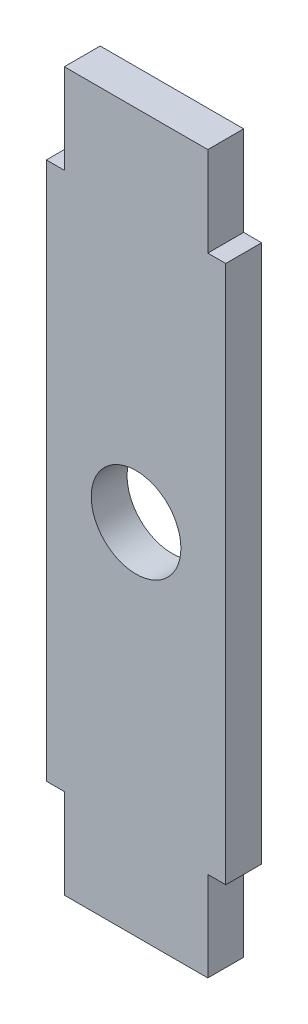
ISO-10303-21;
HEADER;
FILE_DESCRIPTION(('STEP AP214'),'2;1');
FILE_NAME('part.step','',(''),(''),'','','');
FILE_SCHEMA(('AUTOMOTIVE_DESIGN { 1 0 10303 214 1 1 1 1 }'));
ENDSEC;
DATA;
#1=APPLICATION_CONTEXT('core data for automotive mechanical design processes');
#2=APPLICATION_PROTOCOL_DEFINITION('international standard','automotive_design',2000,#1);
#3=PRODUCT_CONTEXT('',#1,'mechanical');
#4=PRODUCT('Part','Part','',(#3));
#5=PRODUCT_RELATED_PRODUCT_CATEGORY('part','',(#4));
#6=PRODUCT_DEFINITION_FORMATION('','',#4);
#7=PRODUCT_DEFINITION_CONTEXT('part definition',#1,'design');
#8=PRODUCT_DEFINITION('design','',#6,#7);
#9=PRODUCT_DEFINITION_SHAPE('','',#8);
#10=(LENGTH_UNIT() NAMED_UNIT(*) SI_UNIT(.MILLI.,.METRE.));
#11=(NAMED_UNIT(*) PLANE_ANGLE_UNIT() SI_UNIT($,.RADIAN.));
#12=(NAMED_UNIT(*) SI_UNIT($,.STERADIAN.) SOLID_ANGLE_UNIT());
#13=UNCERTAINTY_MEASURE_WITH_UNIT(LENGTH_MEASURE(1.E-05),#10,'distance_accuracy_value','');
#14=(GEOMETRIC_REPRESENTATION_CONTEXT(3) GLOBAL_UNCERTAINTY_ASSIGNED_CONTEXT((#13)) GLOBAL_UNIT_ASSIGNED_CONTEXT((#10,
#11,#12)) REPRESENTATION_CONTEXT('',''));
#15=CARTESIAN_POINT('',(0.,0.,0.));
#16=DIRECTION('',(0.,0.,1.));
#17=DIRECTION('',(1.,0.,0.));
#18=AXIS2_PLACEMENT_3D('',#15,#16,#17);
#19=CARTESIAN_POINT('',(0.,0.,2.));
#20=DIRECTION('',(0.,0.,-1.));
#21=DIRECTION('',(-1.,0.,0.));
#22=AXIS2_PLACEMENT_3D('',#19,#20,#21);
#23=PLANE('',#22);
#24=DIRECTION('',(0.,-1.,0.));
#25=VECTOR('',#24,1.);
#26=CARTESIAN_POINT('',(-5.00000000000001,15.,2.));
#27=LINE('',#26,#25);
#28=CARTESIAN_POINT('',(-5.00000000000001,15.,2.));
#29=VERTEX_POINT('',#28);
#30=CARTESIAN_POINT('',(-5.,-15.,2.));
#31=VERTEX_POINT('',#30);
#32=EDGE_CURVE('E200',#29,#31,#27,.T.);
#33=ORIENTED_EDGE('',*,*,#32,.T.);
#34=DIRECTION('',(1.,0.,0.));
#35=VECTOR('',#34,1.);
#36=CARTESIAN_POINT('',(-4.,-15.,2.));
#37=LINE('',#36,#35);
#38=CARTESIAN_POINT('',(-4.,-15.,2.));
#39=VERTEX_POINT('',#38);
#40=EDGE_CURVE('E112',#31,#39,#37,.T.);
#41=ORIENTED_EDGE('',*,*,#40,.T.);
#42=DIRECTION('',(0.,-1.,0.));
#43=VECTOR('',#42,1.);
#44=CARTESIAN_POINT('',(-4.,-20.,2.));
#45=LINE('',#44,#43);
#46=CARTESIAN_POINT('',(-4.,-20.,2.));
#47=VERTEX_POINT('',#46);
#48=EDGE_CURVE('E237',#39,#47,#45,.T.);
#49=ORIENTED_EDGE('',*,*,#48,.T.);
#50=DIRECTION('',(1.,0.,0.));
#51=VECTOR('',#50,1.);
#52=CARTESIAN_POINT('',(4.,-20.,2.));
#53=LINE('',#52,#51);
#54=CARTESIAN_POINT('',(4.,-20.,2.));
#55=VERTEX_POINT('',#54);
#56=EDGE_CURVE('E257',#47,#55,#53,.T.);
#57=ORIENTED_EDGE('',*,*,#56,.T.);
#58=DIRECTION('',(0.,1.,0.));
#59=VECTOR('',#58,1.);
#60=CARTESIAN_POINT('',(4.,-20.,2.));
#61=LINE('',#60,#59);
#62=CARTESIAN_POINT('',(4.,-15.,2.));
#63=VERTEX_POINT('',#62);
#64=EDGE_CURVE('E253',#55,#63,#61,.T.);
#65=ORIENTED_EDGE('',*,*,#64,.T.);
#66=DIRECTION('',(1.,0.,0.));
#67=VECTOR('',#66,1.);
#68=CARTESIAN_POINT('',(5.,-15.,2.));
#69=LINE('',#68,#67);
#70=CARTESIAN_POINT('',(5.,-15.,2.));
#71=VERTEX_POINT('',#70);
#72=EDGE_CURVE('E256',#63,#71,#69,.T.);
#73=ORIENTED_EDGE('',*,*,#72,.T.);
#74=DIRECTION('',(0.,1.,0.));
#75=VECTOR('',#74,1.);
#76=CARTESIAN_POINT('',(5.,15.,2.));
#77=LINE('',#76,#75);
#78=CARTESIAN_POINT('',(5.,15.,2.));
#79=VERTEX_POINT('',#78);
#80=EDGE_CURVE('E261',#71,#79,#77,.T.);
#81=ORIENTED_EDGE('',*,*,#80,.T.);
#82=DIRECTION('',(-1.,0.,0.));
#83=VECTOR('',#82,1.);
#84=CARTESIAN_POINT('',(5.,15.,2.));
#85=LINE('',#84,#83);
#86=CARTESIAN_POINT('',(4.,15.,2.));
#87=VERTEX_POINT('',#86);
#88=EDGE_CURVE('E268',#79,#87,#85,.T.);
#89=ORIENTED_EDGE('',*,*,#88,.T.);
#90=DIRECTION('',(0.,1.,0.));
#91=VECTOR('',#90,1.);
#92=CARTESIAN_POINT('',(4.,15.,2.));
#93=LINE('',#92,#91);
#94=CARTESIAN_POINT('',(4.,20.,2.));
#95=VERTEX_POINT('',#94);
#96=EDGE_CURVE('E143',#87,#95,#93,.T.);
#97=ORIENTED_EDGE('',*,*,#96,.T.);
#98=DIRECTION('',(-1.,0.,0.));
#99=VECTOR('',#98,1.);
#100=CARTESIAN_POINT('',(4.,20.,2.));
#101=LINE('',#100,#99);
#102=CARTESIAN_POINT('',(-4.,20.,2.));
#103=VERTEX_POINT('',#102);
#104=EDGE_CURVE('E137',#95,#103,#101,.T.);
#105=ORIENTED_EDGE('',*,*,#104,.T.);
#106=DIRECTION('',(0.,-1.,0.));
#107=VECTOR('',#106,1.);
#108=CARTESIAN_POINT('',(-4.,15.,2.));
#109=LINE('',#108,#107);
#110=CARTESIAN_POINT('',(-4.,15.,2.));
#111=VERTEX_POINT('',#110);
#112=EDGE_CURVE('E141',#103,#111,#109,.T.);
#113=ORIENTED_EDGE('',*,*,#112,.T.);
#114=DIRECTION('',(-1.,0.,0.));
#115=VECTOR('',#114,1.);
#116=CARTESIAN_POINT('',(-4.,15.,2.));
#117=LINE('',#116,#115);
#118=EDGE_CURVE('E57',#111,#29,#117,.T.);
#119=ORIENTED_EDGE('',*,*,#118,.T.);
#120=EDGE_LOOP('',(#33,#41,#49,#57,#65,#73,#81,#89,#97,#105,#113,#119));
#121=FACE_BOUND('',#120,.T.);
#122=CARTESIAN_POINT('',(0.,0.,2.));
#123=DIRECTION('',(0.,0.,1.));
#124=DIRECTION('',(1.,0.,0.));
#125=AXIS2_PLACEMENT_3D('',#122,#123,#124);
#126=CIRCLE('',#125,2.5);
#127=CARTESIAN_POINT('',(2.5,0.,2.));
#128=VERTEX_POINT('',#127);
#129=EDGE_CURVE('E170',#128,#128,#126,.T.);
#130=ORIENTED_EDGE('',*,*,#129,.F.);
#131=EDGE_LOOP('',(#130));
#132=FACE_BOUND('',#131,.T.);
#133=ADVANCED_FACE('F39',(#121,#132),#23,.F.);
#134=CARTESIAN_POINT('',(0.,0.,0.));
#135=DIRECTION('',(0.,0.,-1.));
#136=DIRECTION('',(-1.,0.,0.));
#137=AXIS2_PLACEMENT_3D('',#134,#135,#136);
#138=PLANE('',#137);
#139=DIRECTION('',(0.,-1.,0.));
#140=VECTOR('',#139,1.);
#141=CARTESIAN_POINT('',(-5.00000000000001,15.,0.));
#142=LINE('',#141,#140);
#143=CARTESIAN_POINT('',(-5.00000000000001,15.,0.));
#144=VERTEX_POINT('',#143);
#145=CARTESIAN_POINT('',(-5.,-15.,0.));
#146=VERTEX_POINT('',#145);
#147=EDGE_CURVE('E165',#144,#146,#142,.T.);
#148=ORIENTED_EDGE('',*,*,#147,.F.);
#149=DIRECTION('',(-1.,0.,0.));
#150=VECTOR('',#149,1.);
#151=CARTESIAN_POINT('',(-4.,15.,0.));
#152=LINE('',#151,#150);
#153=CARTESIAN_POINT('',(-4.,15.,0.));
#154=VERTEX_POINT('',#153);
#155=EDGE_CURVE('E104',#154,#144,#152,.T.);
#156=ORIENTED_EDGE('',*,*,#155,.F.);
#157=DIRECTION('',(0.,-1.,0.));
#158=VECTOR('',#157,1.);
#159=CARTESIAN_POINT('',(-4.,15.,0.));
#160=LINE('',#159,#158);
#161=CARTESIAN_POINT('',(-4.,20.,0.));
#162=VERTEX_POINT('',#161);
#163=EDGE_CURVE('E98',#162,#154,#160,.T.);
#164=ORIENTED_EDGE('',*,*,#163,.F.);
#165=DIRECTION('',(-1.,0.,0.));
#166=VECTOR('',#165,1.);
#167=CARTESIAN_POINT('',(4.,20.,0.));
#168=LINE('',#167,#166);
#169=CARTESIAN_POINT('',(4.,20.,0.));
#170=VERTEX_POINT('',#169);
#171=EDGE_CURVE('E152',#170,#162,#168,.T.);
#172=ORIENTED_EDGE('',*,*,#171,.F.);
#173=DIRECTION('',(0.,1.,0.));
#174=VECTOR('',#173,1.);
#175=CARTESIAN_POINT('',(4.,15.,0.));
#176=LINE('',#175,#174);
#177=CARTESIAN_POINT('',(4.,15.,0.));
#178=VERTEX_POINT('',#177);
#179=EDGE_CURVE('E191',#178,#170,#176,.T.);
#180=ORIENTED_EDGE('',*,*,#179,.F.);
#181=DIRECTION('',(-1.,0.,0.));
#182=VECTOR('',#181,1.);
#183=CARTESIAN_POINT('',(5.,15.,0.));
#184=LINE('',#183,#182);
#185=CARTESIAN_POINT('',(5.,15.,0.));
#186=VERTEX_POINT('',#185);
#187=EDGE_CURVE('E188',#186,#178,#184,.T.);
#188=ORIENTED_EDGE('',*,*,#187,.F.);
#189=DIRECTION('',(0.,1.,0.));
#190=VECTOR('',#189,1.);
#191=CARTESIAN_POINT('',(5.,15.,0.));
#192=LINE('',#191,#190);
#193=CARTESIAN_POINT('',(5.,-15.,0.));
#194=VERTEX_POINT('',#193);
#195=EDGE_CURVE('E185',#194,#186,#192,.T.);
#196=ORIENTED_EDGE('',*,*,#195,.F.);
#197=DIRECTION('',(1.,0.,0.));
#198=VECTOR('',#197,1.);
#199=CARTESIAN_POINT('',(5.,-15.,0.));
#200=LINE('',#199,#198);
#201=CARTESIAN_POINT('',(4.,-15.,0.));
#202=VERTEX_POINT('',#201);
#203=EDGE_CURVE('E182',#202,#194,#200,.T.);
#204=ORIENTED_EDGE('',*,*,#203,.F.);
#205=DIRECTION('',(0.,1.,0.));
#206=VECTOR('',#205,1.);
#207=CARTESIAN_POINT('',(4.,-20.,0.));
#208=LINE('',#207,#206);
#209=CARTESIAN_POINT('',(4.,-20.,0.));
#210=VERTEX_POINT('',#209);
#211=EDGE_CURVE('E179',#210,#202,#208,.T.);
#212=ORIENTED_EDGE('',*,*,#211,.F.);
#213=DIRECTION('',(1.,0.,0.));
#214=VECTOR('',#213,1.);
#215=CARTESIAN_POINT('',(4.,-20.,0.));
#216=LINE('',#215,#214);
#217=CARTESIAN_POINT('',(-4.,-20.,0.));
#218=VERTEX_POINT('',#217);
#219=EDGE_CURVE('E176',#218,#210,#216,.T.);
#220=ORIENTED_EDGE('',*,*,#219,.F.);
#221=DIRECTION('',(0.,-1.,0.));
#222=VECTOR('',#221,1.);
#223=CARTESIAN_POINT('',(-4.,-20.,0.));
#224=LINE('',#223,#222);
#225=CARTESIAN_POINT('',(-4.,-15.,0.));
#226=VERTEX_POINT('',#225);
#227=EDGE_CURVE('E173',#226,#218,#224,.T.);
#228=ORIENTED_EDGE('',*,*,#227,.F.);
#229=DIRECTION('',(1.,0.,0.));
#230=VECTOR('',#229,1.);
#231=CARTESIAN_POINT('',(-4.,-15.,0.));
#232=LINE('',#231,#230);
#233=EDGE_CURVE('E169',#146,#226,#232,.T.);
#234=ORIENTED_EDGE('',*,*,#233,.F.);
#235=EDGE_LOOP('',(#148,#156,#164,#172,#180,#188,#196,#204,#212,#220,#228,#234));
#236=FACE_BOUND('',#235,.T.);
#237=CARTESIAN_POINT('',(0.,0.,0.));
#238=DIRECTION('',(0.,0.,1.));
#239=DIRECTION('',(1.,0.,0.));
#240=AXIS2_PLACEMENT_3D('',#237,#238,#239);
#241=CIRCLE('',#240,2.5);
#242=CARTESIAN_POINT('',(2.5,0.,0.));
#243=VERTEX_POINT('',#242);
#244=EDGE_CURVE('E417',#243,#243,#241,.T.);
#245=ORIENTED_EDGE('',*,*,#244,.T.);
#246=EDGE_LOOP('',(#245));
#247=FACE_BOUND('',#246,.T.);
#248=ADVANCED_FACE('F241',(#236,#247),#138,.T.);
#249=CARTESIAN_POINT('',(-5.00000000000001,15.,2.));
#250=DIRECTION('',(1.,0.,0.));
#251=DIRECTION('',(0.,1.,0.));
#252=AXIS2_PLACEMENT_3D('',#249,#250,#251);
#253=PLANE('',#252);
#254=ORIENTED_EDGE('',*,*,#147,.T.);
#255=DIRECTION('',(0.,0.,-1.));
#256=VECTOR('',#255,1.);
#257=CARTESIAN_POINT('',(-5.,-15.,2.));
#258=LINE('',#257,#256);
#259=EDGE_CURVE('E11',#31,#146,#258,.T.);
#260=ORIENTED_EDGE('',*,*,#259,.F.);
#261=ORIENTED_EDGE('',*,*,#32,.F.);
#262=DIRECTION('',(0.,0.,-1.));
#263=VECTOR('',#262,1.);
#264=CARTESIAN_POINT('',(-5.00000000000001,15.,2.));
#265=LINE('',#264,#263);
#266=EDGE_CURVE('E161',#29,#144,#265,.T.);
#267=ORIENTED_EDGE('',*,*,#266,.T.);
#268=EDGE_LOOP('',(#254,#260,#261,#267));
#269=FACE_BOUND('',#268,.T.);
#270=ADVANCED_FACE('F41',(#269),#253,.F.);
#271=CARTESIAN_POINT('',(-4.,-15.,2.));
#272=DIRECTION('',(0.,1.,0.));
#273=DIRECTION('',(-1.,0.,0.));
#274=AXIS2_PLACEMENT_3D('',#271,#272,#273);
#275=PLANE('',#274);
#276=ORIENTED_EDGE('',*,*,#233,.T.);
#277=DIRECTION('',(0.,0.,-1.));
#278=VECTOR('',#277,1.);
#279=CARTESIAN_POINT('',(-4.,-15.,2.));
#280=LINE('',#279,#278);
#281=EDGE_CURVE('E49',#39,#226,#280,.T.);
#282=ORIENTED_EDGE('',*,*,#281,.F.);
#283=ORIENTED_EDGE('',*,*,#40,.F.);
#284=ORIENTED_EDGE('',*,*,#259,.T.);
#285=EDGE_LOOP('',(#276,#282,#283,#284));
#286=FACE_BOUND('',#285,.T.);
#287=ADVANCED_FACE('F304',(#286),#275,.F.);
#288=CARTESIAN_POINT('',(-4.,-20.,2.));
#289=DIRECTION('',(1.,0.,0.));
#290=DIRECTION('',(0.,0.,-1.));
#291=AXIS2_PLACEMENT_3D('',#288,#289,#290);
#292=PLANE('',#291);
#293=ORIENTED_EDGE('',*,*,#227,.T.);
#294=DIRECTION('',(0.,0.,-1.));
#295=VECTOR('',#294,1.);
#296=CARTESIAN_POINT('',(-4.,-20.,2.));
#297=LINE('',#296,#295);
#298=EDGE_CURVE('E227',#47,#218,#297,.T.);
#299=ORIENTED_EDGE('',*,*,#298,.F.);
#300=ORIENTED_EDGE('',*,*,#48,.F.);
#301=ORIENTED_EDGE('',*,*,#281,.T.);
#302=EDGE_LOOP('',(#293,#299,#300,#301));
#303=FACE_BOUND('',#302,.T.);
#304=ADVANCED_FACE('F235',(#303),#292,.F.);
#305=CARTESIAN_POINT('',(4.,-20.,2.));
#306=DIRECTION('',(0.,1.,0.));
#307=DIRECTION('',(0.,0.,1.));
#308=AXIS2_PLACEMENT_3D('',#305,#306,#307);
#309=PLANE('',#308);
#310=ORIENTED_EDGE('',*,*,#219,.T.);
#311=DIRECTION('',(0.,0.,-1.));
#312=VECTOR('',#311,1.);
#313=CARTESIAN_POINT('',(4.,-20.,2.));
#314=LINE('',#313,#312);
#315=EDGE_CURVE('E223',#55,#210,#314,.T.);
#316=ORIENTED_EDGE('',*,*,#315,.F.);
#317=ORIENTED_EDGE('',*,*,#56,.F.);
#318=ORIENTED_EDGE('',*,*,#298,.T.);
#319=EDGE_LOOP('',(#310,#316,#317,#318));
#320=FACE_BOUND('',#319,.T.);
#321=ADVANCED_FACE('F247',(#320),#309,.F.);
#322=CARTESIAN_POINT('',(4.,-20.,2.));
#323=DIRECTION('',(-1.,0.,0.));
#324=DIRECTION('',(0.,-1.,0.));
#325=AXIS2_PLACEMENT_3D('',#322,#323,#324);
#326=PLANE('',#325);
#327=ORIENTED_EDGE('',*,*,#211,.T.);
#328=DIRECTION('',(0.,0.,-1.));
#329=VECTOR('',#328,1.);
#330=CARTESIAN_POINT('',(4.,-15.,2.));
#331=LINE('',#330,#329);
#332=EDGE_CURVE('E219',#63,#202,#331,.T.);
#333=ORIENTED_EDGE('',*,*,#332,.F.);
#334=ORIENTED_EDGE('',*,*,#64,.F.);
#335=ORIENTED_EDGE('',*,*,#315,.T.);
#336=EDGE_LOOP('',(#327,#333,#334,#335));
#337=FACE_BOUND('',#336,.T.);
#338=ADVANCED_FACE('F251',(#337),#326,.F.);
#339=CARTESIAN_POINT('',(5.,-15.,2.));
#340=DIRECTION('',(0.,1.,0.));
#341=DIRECTION('',(0.,0.,1.));
#342=AXIS2_PLACEMENT_3D('',#339,#340,#341);
#343=PLANE('',#342);
#344=ORIENTED_EDGE('',*,*,#203,.T.);
#345=DIRECTION('',(0.,0.,-1.));
#346=VECTOR('',#345,1.);
#347=CARTESIAN_POINT('',(5.,-15.,2.));
#348=LINE('',#347,#346);
#349=EDGE_CURVE('E215',#71,#194,#348,.T.);
#350=ORIENTED_EDGE('',*,*,#349,.F.);
#351=ORIENTED_EDGE('',*,*,#72,.F.);
#352=ORIENTED_EDGE('',*,*,#332,.T.);
#353=EDGE_LOOP('',(#344,#350,#351,#352));
#354=FACE_BOUND('',#353,.T.);
#355=ADVANCED_FACE('F317',(#354),#343,.F.);
#356=CARTESIAN_POINT('',(5.,15.,2.));
#357=DIRECTION('',(-1.,0.,0.));
#358=DIRECTION('',(0.,-1.,0.));
#359=AXIS2_PLACEMENT_3D('',#356,#357,#358);
#360=PLANE('',#359);
#361=ORIENTED_EDGE('',*,*,#195,.T.);
#362=DIRECTION('',(0.,0.,-1.));
#363=VECTOR('',#362,1.);
#364=CARTESIAN_POINT('',(5.,15.,2.));
#365=LINE('',#364,#363);
#366=EDGE_CURVE('E211',#79,#186,#365,.T.);
#367=ORIENTED_EDGE('',*,*,#366,.F.);
#368=ORIENTED_EDGE('',*,*,#80,.F.);
#369=ORIENTED_EDGE('',*,*,#349,.T.);
#370=EDGE_LOOP('',(#361,#367,#368,#369));
#371=FACE_BOUND('',#370,.T.);
#372=ADVANCED_FACE('F320',(#371),#360,.F.);
#373=CARTESIAN_POINT('',(5.,15.,2.));
#374=DIRECTION('',(0.,-1.,0.));
#375=DIRECTION('',(0.,0.,-1.));
#376=AXIS2_PLACEMENT_3D('',#373,#374,#375);
#377=PLANE('',#376);
#378=ORIENTED_EDGE('',*,*,#187,.T.);
#379=DIRECTION('',(0.,0.,-1.));
#380=VECTOR('',#379,1.);
#381=CARTESIAN_POINT('',(4.,15.,2.));
#382=LINE('',#381,#380);
#383=EDGE_CURVE('E207',#87,#178,#382,.T.);
#384=ORIENTED_EDGE('',*,*,#383,.F.);
#385=ORIENTED_EDGE('',*,*,#88,.F.);
#386=ORIENTED_EDGE('',*,*,#366,.T.);
#387=EDGE_LOOP('',(#378,#384,#385,#386));
#388=FACE_BOUND('',#387,.T.);
#389=ADVANCED_FACE('F276',(#388),#377,.F.);
#390=CARTESIAN_POINT('',(4.,15.,2.));
#391=DIRECTION('',(-1.,0.,0.));
#392=DIRECTION('',(0.,-1.,0.));
#393=AXIS2_PLACEMENT_3D('',#390,#391,#392);
#394=PLANE('',#393);
#395=ORIENTED_EDGE('',*,*,#179,.T.);
#396=DIRECTION('',(0.,0.,-1.));
#397=VECTOR('',#396,1.);
#398=CARTESIAN_POINT('',(4.,20.,2.));
#399=LINE('',#398,#397);
#400=EDGE_CURVE('E154',#95,#170,#399,.T.);
#401=ORIENTED_EDGE('',*,*,#400,.F.);
#402=ORIENTED_EDGE('',*,*,#96,.F.);
#403=ORIENTED_EDGE('',*,*,#383,.T.);
#404=EDGE_LOOP('',(#395,#401,#402,#403));
#405=FACE_BOUND('',#404,.T.);
#406=ADVANCED_FACE('F280',(#405),#394,.F.);
#407=CARTESIAN_POINT('',(4.,20.,2.));
#408=DIRECTION('',(0.,-1.,0.));
#409=DIRECTION('',(0.,0.,-1.));
#410=AXIS2_PLACEMENT_3D('',#407,#408,#409);
#411=PLANE('',#410);
#412=ORIENTED_EDGE('',*,*,#171,.T.);
#413=DIRECTION('',(0.,0.,-1.));
#414=VECTOR('',#413,1.);
#415=CARTESIAN_POINT('',(-4.,20.,2.));
#416=LINE('',#415,#414);
#417=EDGE_CURVE('E149',#103,#162,#416,.T.);
#418=ORIENTED_EDGE('',*,*,#417,.F.);
#419=ORIENTED_EDGE('',*,*,#104,.F.);
#420=ORIENTED_EDGE('',*,*,#400,.T.);
#421=EDGE_LOOP('',(#412,#418,#419,#420));
#422=FACE_BOUND('',#421,.T.);
#423=ADVANCED_FACE('F150',(#422),#411,.F.);
#424=CARTESIAN_POINT('',(-4.,15.,2.));
#425=DIRECTION('',(1.,0.,0.));
#426=DIRECTION('',(0.,0.,-1.));
#427=AXIS2_PLACEMENT_3D('',#424,#425,#426);
#428=PLANE('',#427);
#429=ORIENTED_EDGE('',*,*,#163,.T.);
#430=DIRECTION('',(0.,0.,-1.));
#431=VECTOR('',#430,1.);
#432=CARTESIAN_POINT('',(-4.,15.,2.));
#433=LINE('',#432,#431);
#434=EDGE_CURVE('E155',#111,#154,#433,.T.);
#435=ORIENTED_EDGE('',*,*,#434,.F.);
#436=ORIENTED_EDGE('',*,*,#112,.F.);
#437=ORIENTED_EDGE('',*,*,#417,.T.);
#438=EDGE_LOOP('',(#429,#435,#436,#437));
#439=FACE_BOUND('',#438,.T.);
#440=ADVANCED_FACE('F157',(#439),#428,.F.);
#441=CARTESIAN_POINT('',(-4.,15.,2.));
#442=DIRECTION('',(0.,-1.,0.));
#443=DIRECTION('',(1.,0.,0.));
#444=AXIS2_PLACEMENT_3D('',#441,#442,#443);
#445=PLANE('',#444);
#446=ORIENTED_EDGE('',*,*,#155,.T.);
#447=ORIENTED_EDGE('',*,*,#266,.F.);
#448=ORIENTED_EDGE('',*,*,#118,.F.);
#449=ORIENTED_EDGE('',*,*,#434,.T.);
#450=EDGE_LOOP('',(#446,#447,#448,#449));
#451=FACE_BOUND('',#450,.T.);
#452=ADVANCED_FACE('F284',(#451),#445,.F.);
#453=CARTESIAN_POINT('',(0.,0.,2.));
#454=DIRECTION('',(0.,0.,-1.));
#455=DIRECTION('',(-1.,0.,0.));
#456=AXIS2_PLACEMENT_3D('',#453,#454,#455);
#457=CYLINDRICAL_SURFACE('',#456,2.5);
#458=ORIENTED_EDGE('',*,*,#129,.T.);
#459=EDGE_LOOP('',(#458));
#460=FACE_BOUND('',#459,.T.);
#461=ORIENTED_EDGE('',*,*,#244,.F.);
#462=EDGE_LOOP('',(#461));
#463=FACE_BOUND('',#462,.T.);
#464=ADVANCED_FACE('F286',(#460,#463),#457,.F.);
#465=CLOSED_SHELL('',(#133,#248,#270,#287,#304,#321,#338,#355,#372,#389,#406,#423,#440,#452,#464));
#466=MANIFOLD_SOLID_BREP('B2',#465);
#467=ADVANCED_BREP_SHAPE_REPRESENTATION('',(#18,#466),#14);
#468=SHAPE_DEFINITION_REPRESENTATION(#9,#467);
ENDSEC;
END-ISO-10303-21;
